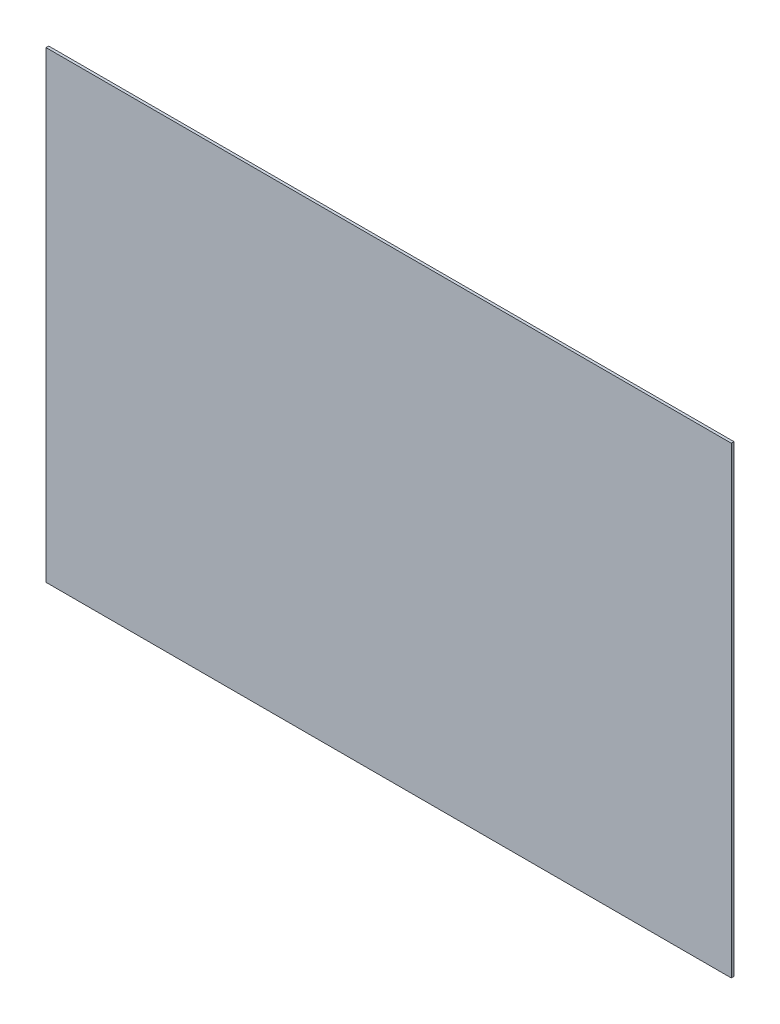
ISO-10303-21;
HEADER;
FILE_DESCRIPTION(('STEP AP214'),'2;1');
FILE_NAME('part.step','',(''),(''),'','','');
FILE_SCHEMA(('AUTOMOTIVE_DESIGN { 1 0 10303 214 1 1 1 1 }'));
ENDSEC;
DATA;
#1=APPLICATION_CONTEXT('core data for automotive mechanical design processes');
#2=APPLICATION_PROTOCOL_DEFINITION('international standard','automotive_design',2000,#1);
#3=PRODUCT_CONTEXT('',#1,'mechanical');
#4=PRODUCT('Part','Part','',(#3));
#5=PRODUCT_RELATED_PRODUCT_CATEGORY('part','',(#4));
#6=PRODUCT_DEFINITION_FORMATION('','',#4);
#7=PRODUCT_DEFINITION_CONTEXT('part definition',#1,'design');
#8=PRODUCT_DEFINITION('design','',#6,#7);
#9=PRODUCT_DEFINITION_SHAPE('','',#8);
#10=(LENGTH_UNIT() NAMED_UNIT(*) SI_UNIT(.MILLI.,.METRE.));
#11=(NAMED_UNIT(*) PLANE_ANGLE_UNIT() SI_UNIT($,.RADIAN.));
#12=(NAMED_UNIT(*) SI_UNIT($,.STERADIAN.) SOLID_ANGLE_UNIT());
#13=UNCERTAINTY_MEASURE_WITH_UNIT(LENGTH_MEASURE(1.E-05),#10,'distance_accuracy_value','');
#14=(GEOMETRIC_REPRESENTATION_CONTEXT(3) GLOBAL_UNCERTAINTY_ASSIGNED_CONTEXT((#13)) GLOBAL_UNIT_ASSIGNED_CONTEXT((#10,
#11,#12)) REPRESENTATION_CONTEXT('',''));
#15=CARTESIAN_POINT('',(0.,0.,0.));
#16=DIRECTION('',(0.,0.,1.));
#17=DIRECTION('',(1.,0.,0.));
#18=AXIS2_PLACEMENT_3D('',#15,#16,#17);
#19=CARTESIAN_POINT('',(0.,0.,0.));
#20=DIRECTION('',(0.,0.,1.));
#21=DIRECTION('',(1.,0.,0.));
#22=AXIS2_PLACEMENT_3D('',#19,#20,#21);
#23=PLANE('',#22);
#24=DIRECTION('',(0.,-1.,0.));
#25=VECTOR('',#24,1.);
#26=CARTESIAN_POINT('',(-127.25,86.,0.));
#27=LINE('',#26,#25);
#28=CARTESIAN_POINT('',(-127.25,86.,0.));
#29=VERTEX_POINT('',#28);
#30=CARTESIAN_POINT('',(-127.25,-86.,0.));
#31=VERTEX_POINT('',#30);
#32=EDGE_CURVE('E128',#29,#31,#27,.T.);
#33=ORIENTED_EDGE('',*,*,#32,.F.);
#34=DIRECTION('',(-1.,0.,0.));
#35=VECTOR('',#34,1.);
#36=CARTESIAN_POINT('',(-127.25,86.,0.));
#37=LINE('',#36,#35);
#38=CARTESIAN_POINT('',(127.25,86.,0.));
#39=VERTEX_POINT('',#38);
#40=EDGE_CURVE('E144',#39,#29,#37,.T.);
#41=ORIENTED_EDGE('',*,*,#40,.F.);
#42=DIRECTION('',(0.,1.,0.));
#43=VECTOR('',#42,1.);
#44=CARTESIAN_POINT('',(127.25,86.,0.));
#45=LINE('',#44,#43);
#46=CARTESIAN_POINT('',(127.25,-86.,0.));
#47=VERTEX_POINT('',#46);
#48=EDGE_CURVE('E156',#47,#39,#45,.T.);
#49=ORIENTED_EDGE('',*,*,#48,.F.);
#50=DIRECTION('',(1.,0.,0.));
#51=VECTOR('',#50,1.);
#52=CARTESIAN_POINT('',(-127.25,-86.,0.));
#53=LINE('',#52,#51);
#54=EDGE_CURVE('E133',#31,#47,#53,.T.);
#55=ORIENTED_EDGE('',*,*,#54,.F.);
#56=EDGE_LOOP('',(#33,#41,#49,#55));
#57=FACE_BOUND('',#56,.T.);
#58=DIRECTION('',(0.,1.,0.));
#59=VECTOR('',#58,1.);
#60=CARTESIAN_POINT('',(-115.,-76.5,0.));
#61=LINE('',#60,#59);
#62=CARTESIAN_POINT('',(-115.,-76.5,0.));
#63=VERTEX_POINT('',#62);
#64=CARTESIAN_POINT('',(-115.,71.5,0.));
#65=VERTEX_POINT('',#64);
#66=EDGE_CURVE('E55',#63,#65,#61,.T.);
#67=ORIENTED_EDGE('',*,*,#66,.F.);
#68=DIRECTION('',(-1.,0.,0.));
#69=VECTOR('',#68,1.);
#70=CARTESIAN_POINT('',(-115.,-76.5,0.));
#71=LINE('',#70,#69);
#72=CARTESIAN_POINT('',(115.,-76.5,0.));
#73=VERTEX_POINT('',#72);
#74=EDGE_CURVE('E59',#73,#63,#71,.T.);
#75=ORIENTED_EDGE('',*,*,#74,.F.);
#76=DIRECTION('',(0.,-1.,0.));
#77=VECTOR('',#76,1.);
#78=CARTESIAN_POINT('',(115.,-76.5,0.));
#79=LINE('',#78,#77);
#80=CARTESIAN_POINT('',(115.,71.5,0.));
#81=VERTEX_POINT('',#80);
#82=EDGE_CURVE('E302',#81,#73,#79,.T.);
#83=ORIENTED_EDGE('',*,*,#82,.F.);
#84=DIRECTION('',(1.,0.,0.));
#85=VECTOR('',#84,1.);
#86=CARTESIAN_POINT('',(-115.,71.5,0.));
#87=LINE('',#86,#85);
#88=EDGE_CURVE('E299',#65,#81,#87,.T.);
#89=ORIENTED_EDGE('',*,*,#88,.F.);
#90=EDGE_LOOP('',(#67,#75,#83,#89));
#91=FACE_BOUND('',#90,.T.);
#92=ADVANCED_FACE('F39',(#57,#91),#23,.F.);
#93=CARTESIAN_POINT('',(-127.25,86.,1.));
#94=DIRECTION('',(1.,0.,0.));
#95=DIRECTION('',(0.,1.,0.));
#96=AXIS2_PLACEMENT_3D('',#93,#94,#95);
#97=PLANE('',#96);
#98=ORIENTED_EDGE('',*,*,#32,.T.);
#99=DIRECTION('',(0.,0.,-1.));
#100=VECTOR('',#99,1.);
#101=CARTESIAN_POINT('',(-127.25,-86.,1.));
#102=LINE('',#101,#100);
#103=CARTESIAN_POINT('',(-127.25,-86.,1.));
#104=VERTEX_POINT('',#103);
#105=EDGE_CURVE('E11',#104,#31,#102,.T.);
#106=ORIENTED_EDGE('',*,*,#105,.F.);
#107=DIRECTION('',(0.,-1.,0.));
#108=VECTOR('',#107,1.);
#109=CARTESIAN_POINT('',(-127.25,86.,1.));
#110=LINE('',#109,#108);
#111=CARTESIAN_POINT('',(-127.25,86.,1.));
#112=VERTEX_POINT('',#111);
#113=EDGE_CURVE('E139',#112,#104,#110,.T.);
#114=ORIENTED_EDGE('',*,*,#113,.F.);
#115=DIRECTION('',(0.,0.,-1.));
#116=VECTOR('',#115,1.);
#117=CARTESIAN_POINT('',(-127.25,86.,1.));
#118=LINE('',#117,#116);
#119=EDGE_CURVE('E152',#112,#29,#118,.T.);
#120=ORIENTED_EDGE('',*,*,#119,.T.);
#121=EDGE_LOOP('',(#98,#106,#114,#120));
#122=FACE_BOUND('',#121,.T.);
#123=ADVANCED_FACE('F41',(#122),#97,.F.);
#124=CARTESIAN_POINT('',(-127.25,-86.,1.));
#125=DIRECTION('',(0.,1.,0.));
#126=DIRECTION('',(0.,0.,1.));
#127=AXIS2_PLACEMENT_3D('',#124,#125,#126);
#128=PLANE('',#127);
#129=ORIENTED_EDGE('',*,*,#54,.T.);
#130=DIRECTION('',(0.,0.,-1.));
#131=VECTOR('',#130,1.);
#132=CARTESIAN_POINT('',(127.25,-86.,1.));
#133=LINE('',#132,#131);
#134=CARTESIAN_POINT('',(127.25,-86.,1.));
#135=VERTEX_POINT('',#134);
#136=EDGE_CURVE('E48',#135,#47,#133,.T.);
#137=ORIENTED_EDGE('',*,*,#136,.F.);
#138=DIRECTION('',(1.,0.,0.));
#139=VECTOR('',#138,1.);
#140=CARTESIAN_POINT('',(-127.25,-86.,1.));
#141=LINE('',#140,#139);
#142=EDGE_CURVE('E143',#104,#135,#141,.T.);
#143=ORIENTED_EDGE('',*,*,#142,.F.);
#144=ORIENTED_EDGE('',*,*,#105,.T.);
#145=EDGE_LOOP('',(#129,#137,#143,#144));
#146=FACE_BOUND('',#145,.T.);
#147=ADVANCED_FACE('F188',(#146),#128,.F.);
#148=CARTESIAN_POINT('',(127.25,86.,1.));
#149=DIRECTION('',(-1.,0.,0.));
#150=DIRECTION('',(0.,0.,1.));
#151=AXIS2_PLACEMENT_3D('',#148,#149,#150);
#152=PLANE('',#151);
#153=ORIENTED_EDGE('',*,*,#48,.T.);
#154=DIRECTION('',(0.,0.,-1.));
#155=VECTOR('',#154,1.);
#156=CARTESIAN_POINT('',(127.25,86.,1.));
#157=LINE('',#156,#155);
#158=CARTESIAN_POINT('',(127.25,86.,1.));
#159=VERTEX_POINT('',#158);
#160=EDGE_CURVE('E164',#159,#39,#157,.T.);
#161=ORIENTED_EDGE('',*,*,#160,.F.);
#162=DIRECTION('',(0.,1.,0.));
#163=VECTOR('',#162,1.);
#164=CARTESIAN_POINT('',(127.25,86.,1.));
#165=LINE('',#164,#163);
#166=EDGE_CURVE('E147',#135,#159,#165,.T.);
#167=ORIENTED_EDGE('',*,*,#166,.F.);
#168=ORIENTED_EDGE('',*,*,#136,.T.);
#169=EDGE_LOOP('',(#153,#161,#167,#168));
#170=FACE_BOUND('',#169,.T.);
#171=ADVANCED_FACE('F173',(#170),#152,.F.);
#172=CARTESIAN_POINT('',(-127.25,86.,1.));
#173=DIRECTION('',(0.,-1.,0.));
#174=DIRECTION('',(0.,0.,-1.));
#175=AXIS2_PLACEMENT_3D('',#172,#173,#174);
#176=PLANE('',#175);
#177=ORIENTED_EDGE('',*,*,#40,.T.);
#178=ORIENTED_EDGE('',*,*,#119,.F.);
#179=DIRECTION('',(-1.,0.,0.));
#180=VECTOR('',#179,1.);
#181=CARTESIAN_POINT('',(-127.25,86.,1.));
#182=LINE('',#181,#180);
#183=EDGE_CURVE('E150',#159,#112,#182,.T.);
#184=ORIENTED_EDGE('',*,*,#183,.F.);
#185=ORIENTED_EDGE('',*,*,#160,.T.);
#186=EDGE_LOOP('',(#177,#178,#184,#185));
#187=FACE_BOUND('',#186,.T.);
#188=ADVANCED_FACE('F181',(#187),#176,.F.);
#189=CARTESIAN_POINT('',(0.,0.,1.));
#190=DIRECTION('',(0.,0.,1.));
#191=DIRECTION('',(1.,0.,0.));
#192=AXIS2_PLACEMENT_3D('',#189,#190,#191);
#193=PLANE('',#192);
#194=ORIENTED_EDGE('',*,*,#113,.T.);
#195=ORIENTED_EDGE('',*,*,#142,.T.);
#196=ORIENTED_EDGE('',*,*,#166,.T.);
#197=ORIENTED_EDGE('',*,*,#183,.T.);
#198=EDGE_LOOP('',(#194,#195,#196,#197));
#199=FACE_BOUND('',#198,.T.);
#200=ADVANCED_FACE('F187',(#199),#193,.T.);
#201=CARTESIAN_POINT('',(-115.,-76.5,-9.));
#202=DIRECTION('',(1.,0.,0.));
#203=DIRECTION('',(0.,1.,0.));
#204=AXIS2_PLACEMENT_3D('',#201,#202,#203);
#205=PLANE('',#204);
#206=ORIENTED_EDGE('',*,*,#66,.T.);
#207=DIRECTION('',(0.,0.,1.));
#208=VECTOR('',#207,1.);
#209=CARTESIAN_POINT('',(-115.,71.5,-9.));
#210=LINE('',#209,#208);
#211=CARTESIAN_POINT('',(-115.,71.5,-9.));
#212=VERTEX_POINT('',#211);
#213=EDGE_CURVE('E108',#212,#65,#210,.T.);
#214=ORIENTED_EDGE('',*,*,#213,.F.);
#215=DIRECTION('',(0.,1.,0.));
#216=VECTOR('',#215,1.);
#217=CARTESIAN_POINT('',(-115.,-76.5,-9.));
#218=LINE('',#217,#216);
#219=CARTESIAN_POINT('',(-115.,-76.5,-9.));
#220=VERTEX_POINT('',#219);
#221=EDGE_CURVE('E115',#220,#212,#218,.T.);
#222=ORIENTED_EDGE('',*,*,#221,.F.);
#223=DIRECTION('',(0.,0.,1.));
#224=VECTOR('',#223,1.);
#225=CARTESIAN_POINT('',(-115.,-76.5,-9.));
#226=LINE('',#225,#224);
#227=EDGE_CURVE('E296',#220,#63,#226,.T.);
#228=ORIENTED_EDGE('',*,*,#227,.T.);
#229=EDGE_LOOP('',(#206,#214,#222,#228));
#230=FACE_BOUND('',#229,.T.);
#231=ADVANCED_FACE('F126',(#230),#205,.F.);
#232=CARTESIAN_POINT('',(-115.,71.5,-9.));
#233=DIRECTION('',(0.,-1.,0.));
#234=DIRECTION('',(1.,0.,0.));
#235=AXIS2_PLACEMENT_3D('',#232,#233,#234);
#236=PLANE('',#235);
#237=ORIENTED_EDGE('',*,*,#88,.T.);
#238=DIRECTION('',(0.,0.,1.));
#239=VECTOR('',#238,1.);
#240=CARTESIAN_POINT('',(115.,71.5,-9.));
#241=LINE('',#240,#239);
#242=CARTESIAN_POINT('',(115.,71.5,-9.));
#243=VERTEX_POINT('',#242);
#244=EDGE_CURVE('E110',#243,#81,#241,.T.);
#245=ORIENTED_EDGE('',*,*,#244,.F.);
#246=DIRECTION('',(1.,0.,0.));
#247=VECTOR('',#246,1.);
#248=CARTESIAN_POINT('',(-115.,71.5,-9.));
#249=LINE('',#248,#247);
#250=EDGE_CURVE('E103',#212,#243,#249,.T.);
#251=ORIENTED_EDGE('',*,*,#250,.F.);
#252=ORIENTED_EDGE('',*,*,#213,.T.);
#253=EDGE_LOOP('',(#237,#245,#251,#252));
#254=FACE_BOUND('',#253,.T.);
#255=ADVANCED_FACE('F106',(#254),#236,.F.);
#256=CARTESIAN_POINT('',(115.,-76.5,-9.));
#257=DIRECTION('',(-1.,0.,0.));
#258=DIRECTION('',(0.,0.,1.));
#259=AXIS2_PLACEMENT_3D('',#256,#257,#258);
#260=PLANE('',#259);
#261=ORIENTED_EDGE('',*,*,#82,.T.);
#262=DIRECTION('',(0.,0.,1.));
#263=VECTOR('',#262,1.);
#264=CARTESIAN_POINT('',(115.,-76.5,-9.));
#265=LINE('',#264,#263);
#266=CARTESIAN_POINT('',(115.,-76.5,-9.));
#267=VERTEX_POINT('',#266);
#268=EDGE_CURVE('E135',#267,#73,#265,.T.);
#269=ORIENTED_EDGE('',*,*,#268,.F.);
#270=DIRECTION('',(0.,-1.,0.));
#271=VECTOR('',#270,1.);
#272=CARTESIAN_POINT('',(115.,-76.5,-9.));
#273=LINE('',#272,#271);
#274=EDGE_CURVE('E114',#243,#267,#273,.T.);
#275=ORIENTED_EDGE('',*,*,#274,.F.);
#276=ORIENTED_EDGE('',*,*,#244,.T.);
#277=EDGE_LOOP('',(#261,#269,#275,#276));
#278=FACE_BOUND('',#277,.T.);
#279=ADVANCED_FACE('F212',(#278),#260,.F.);
#280=CARTESIAN_POINT('',(-115.,-76.5,-9.));
#281=DIRECTION('',(0.,1.,0.));
#282=DIRECTION('',(-1.,0.,0.));
#283=AXIS2_PLACEMENT_3D('',#280,#281,#282);
#284=PLANE('',#283);
#285=ORIENTED_EDGE('',*,*,#74,.T.);
#286=ORIENTED_EDGE('',*,*,#227,.F.);
#287=DIRECTION('',(-1.,0.,0.));
#288=VECTOR('',#287,1.);
#289=CARTESIAN_POINT('',(-115.,-76.5,-9.));
#290=LINE('',#289,#288);
#291=EDGE_CURVE('E120',#267,#220,#290,.T.);
#292=ORIENTED_EDGE('',*,*,#291,.F.);
#293=ORIENTED_EDGE('',*,*,#268,.T.);
#294=EDGE_LOOP('',(#285,#286,#292,#293));
#295=FACE_BOUND('',#294,.T.);
#296=ADVANCED_FACE('F217',(#295),#284,.F.);
#297=CARTESIAN_POINT('',(0.,0.,-9.));
#298=DIRECTION('',(0.,0.,-1.));
#299=DIRECTION('',(-1.,0.,0.));
#300=AXIS2_PLACEMENT_3D('',#297,#298,#299);
#301=PLANE('',#300);
#302=CARTESIAN_POINT('',(-29.,-26.5,-9.));
#303=DIRECTION('',(0.,0.,-1.));
#304=DIRECTION('',(-1.,0.,0.));
#305=AXIS2_PLACEMENT_3D('',#302,#303,#304);
#306=CIRCLE('',#305,1.75);
#307=CARTESIAN_POINT('',(-30.75,-26.5,-9.));
#308=VERTEX_POINT('',#307);
#309=EDGE_CURVE('E278',#308,#308,#306,.T.);
#310=ORIENTED_EDGE('',*,*,#309,.F.);
#311=EDGE_LOOP('',(#310));
#312=FACE_BOUND('',#311,.T.);
#313=CARTESIAN_POINT('',(29.,22.5,-9.));
#314=DIRECTION('',(0.,0.,-1.));
#315=DIRECTION('',(-1.,0.,0.));
#316=AXIS2_PLACEMENT_3D('',#313,#314,#315);
#317=CIRCLE('',#316,1.75);
#318=CARTESIAN_POINT('',(27.25,22.5,-9.));
#319=VERTEX_POINT('',#318);
#320=EDGE_CURVE('E262',#319,#319,#317,.T.);
#321=ORIENTED_EDGE('',*,*,#320,.F.);
#322=EDGE_LOOP('',(#321));
#323=FACE_BOUND('',#322,.T.);
#324=CARTESIAN_POINT('',(-29.,22.5,-9.));
#325=DIRECTION('',(0.,0.,-1.));
#326=DIRECTION('',(-1.,0.,0.));
#327=AXIS2_PLACEMENT_3D('',#324,#325,#326);
#328=CIRCLE('',#327,1.75);
#329=CARTESIAN_POINT('',(-30.75,22.5,-9.));
#330=VERTEX_POINT('',#329);
#331=EDGE_CURVE('E263',#330,#330,#328,.T.);
#332=ORIENTED_EDGE('',*,*,#331,.F.);
#333=EDGE_LOOP('',(#332));
#334=FACE_BOUND('',#333,.T.);
#335=CARTESIAN_POINT('',(29.,-26.5,-9.));
#336=DIRECTION('',(0.,0.,-1.));
#337=DIRECTION('',(-1.,0.,0.));
#338=AXIS2_PLACEMENT_3D('',#335,#336,#337);
#339=CIRCLE('',#338,1.75);
#340=CARTESIAN_POINT('',(27.25,-26.5,-9.));
#341=VERTEX_POINT('',#340);
#342=EDGE_CURVE('E277',#341,#341,#339,.T.);
#343=ORIENTED_EDGE('',*,*,#342,.F.);
#344=EDGE_LOOP('',(#343));
#345=FACE_BOUND('',#344,.T.);
#346=ORIENTED_EDGE('',*,*,#221,.T.);
#347=ORIENTED_EDGE('',*,*,#250,.T.);
#348=ORIENTED_EDGE('',*,*,#274,.T.);
#349=ORIENTED_EDGE('',*,*,#291,.T.);
#350=EDGE_LOOP('',(#346,#347,#348,#349));
#351=FACE_BOUND('',#350,.T.);
#352=ADVANCED_FACE('F118',(#312,#323,#334,#345,#351),#301,.T.);
#353=CARTESIAN_POINT('',(29.,-26.5,-7.));
#354=DIRECTION('',(0.,0.,-1.));
#355=DIRECTION('',(-1.,0.,0.));
#356=AXIS2_PLACEMENT_3D('',#353,#354,#355);
#357=CYLINDRICAL_SURFACE('',#356,1.75);
#358=CARTESIAN_POINT('',(29.,-26.5,-7.));
#359=DIRECTION('',(0.,0.,-1.));
#360=DIRECTION('',(-1.,0.,0.));
#361=AXIS2_PLACEMENT_3D('',#358,#359,#360);
#362=CIRCLE('',#361,1.75);
#363=CARTESIAN_POINT('',(27.25,-26.5,-7.));
#364=VERTEX_POINT('',#363);
#365=EDGE_CURVE('E285',#364,#364,#362,.T.);
#366=ORIENTED_EDGE('',*,*,#365,.F.);
#367=EDGE_LOOP('',(#366));
#368=FACE_BOUND('',#367,.T.);
#369=ORIENTED_EDGE('',*,*,#342,.T.);
#370=EDGE_LOOP('',(#369));
#371=FACE_BOUND('',#370,.T.);
#372=ADVANCED_FACE('F224',(#368,#371),#357,.F.);
#373=CARTESIAN_POINT('',(29.,-26.5,-7.));
#374=DIRECTION('',(0.,0.,-1.));
#375=DIRECTION('',(-1.,0.,0.));
#376=AXIS2_PLACEMENT_3D('',#373,#374,#375);
#377=PLANE('',#376);
#378=ORIENTED_EDGE('',*,*,#365,.T.);
#379=EDGE_LOOP('',(#378));
#380=FACE_BOUND('',#379,.T.);
#381=ADVANCED_FACE('F228',(#380),#377,.T.);
#382=CARTESIAN_POINT('',(-29.,22.5,-7.));
#383=DIRECTION('',(0.,0.,-1.));
#384=DIRECTION('',(-1.,0.,0.));
#385=AXIS2_PLACEMENT_3D('',#382,#383,#384);
#386=CYLINDRICAL_SURFACE('',#385,1.75);
#387=CARTESIAN_POINT('',(-29.,22.5,-7.));
#388=DIRECTION('',(0.,0.,-1.));
#389=DIRECTION('',(-1.,0.,0.));
#390=AXIS2_PLACEMENT_3D('',#387,#388,#389);
#391=CIRCLE('',#390,1.75);
#392=CARTESIAN_POINT('',(-30.75,22.5,-7.));
#393=VERTEX_POINT('',#392);
#394=EDGE_CURVE('E260',#393,#393,#391,.T.);
#395=ORIENTED_EDGE('',*,*,#394,.F.);
#396=EDGE_LOOP('',(#395));
#397=FACE_BOUND('',#396,.T.);
#398=ORIENTED_EDGE('',*,*,#331,.T.);
#399=EDGE_LOOP('',(#398));
#400=FACE_BOUND('',#399,.T.);
#401=ADVANCED_FACE('F232',(#397,#400),#386,.F.);
#402=CARTESIAN_POINT('',(-29.,22.5,-7.));
#403=DIRECTION('',(0.,0.,-1.));
#404=DIRECTION('',(-1.,0.,0.));
#405=AXIS2_PLACEMENT_3D('',#402,#403,#404);
#406=PLANE('',#405);
#407=ORIENTED_EDGE('',*,*,#394,.T.);
#408=EDGE_LOOP('',(#407));
#409=FACE_BOUND('',#408,.T.);
#410=ADVANCED_FACE('F238',(#409),#406,.T.);
#411=CARTESIAN_POINT('',(29.,22.5,-7.));
#412=DIRECTION('',(0.,0.,-1.));
#413=DIRECTION('',(-1.,0.,0.));
#414=AXIS2_PLACEMENT_3D('',#411,#412,#413);
#415=CYLINDRICAL_SURFACE('',#414,1.75);
#416=CARTESIAN_POINT('',(29.,22.5,-7.));
#417=DIRECTION('',(0.,0.,-1.));
#418=DIRECTION('',(-1.,0.,0.));
#419=AXIS2_PLACEMENT_3D('',#416,#417,#418);
#420=CIRCLE('',#419,1.75);
#421=CARTESIAN_POINT('',(27.25,22.5,-7.));
#422=VERTEX_POINT('',#421);
#423=EDGE_CURVE('E268',#422,#422,#420,.T.);
#424=ORIENTED_EDGE('',*,*,#423,.F.);
#425=EDGE_LOOP('',(#424));
#426=FACE_BOUND('',#425,.T.);
#427=ORIENTED_EDGE('',*,*,#320,.T.);
#428=EDGE_LOOP('',(#427));
#429=FACE_BOUND('',#428,.T.);
#430=ADVANCED_FACE('F234',(#426,#429),#415,.F.);
#431=CARTESIAN_POINT('',(29.,22.5,-7.));
#432=DIRECTION('',(0.,0.,-1.));
#433=DIRECTION('',(-1.,0.,0.));
#434=AXIS2_PLACEMENT_3D('',#431,#432,#433);
#435=PLANE('',#434);
#436=ORIENTED_EDGE('',*,*,#423,.T.);
#437=EDGE_LOOP('',(#436));
#438=FACE_BOUND('',#437,.T.);
#439=ADVANCED_FACE('F237',(#438),#435,.T.);
#440=CARTESIAN_POINT('',(-29.,-26.5,-7.));
#441=DIRECTION('',(0.,0.,-1.));
#442=DIRECTION('',(-1.,0.,0.));
#443=AXIS2_PLACEMENT_3D('',#440,#441,#442);
#444=CYLINDRICAL_SURFACE('',#443,1.75);
#445=CARTESIAN_POINT('',(-29.,-26.5,-7.));
#446=DIRECTION('',(0.,0.,-1.));
#447=DIRECTION('',(-1.,0.,0.));
#448=AXIS2_PLACEMENT_3D('',#445,#446,#447);
#449=CIRCLE('',#448,1.75);
#450=CARTESIAN_POINT('',(-30.75,-26.5,-7.));
#451=VERTEX_POINT('',#450);
#452=EDGE_CURVE('E273',#451,#451,#449,.T.);
#453=ORIENTED_EDGE('',*,*,#452,.F.);
#454=EDGE_LOOP('',(#453));
#455=FACE_BOUND('',#454,.T.);
#456=ORIENTED_EDGE('',*,*,#309,.T.);
#457=EDGE_LOOP('',(#456));
#458=FACE_BOUND('',#457,.T.);
#459=ADVANCED_FACE('F242',(#455,#458),#444,.F.);
#460=CARTESIAN_POINT('',(-29.,-26.5,-7.));
#461=DIRECTION('',(0.,0.,-1.));
#462=DIRECTION('',(-1.,0.,0.));
#463=AXIS2_PLACEMENT_3D('',#460,#461,#462);
#464=PLANE('',#463);
#465=ORIENTED_EDGE('',*,*,#452,.T.);
#466=EDGE_LOOP('',(#465));
#467=FACE_BOUND('',#466,.T.);
#468=ADVANCED_FACE('F246',(#467),#464,.T.);
#469=CLOSED_SHELL('',(#92,#123,#147,#171,#188,#200,#231,#255,#279,#296,#352,#372,#381,#401,#410,
#430,#439,#459,#468));
#470=MANIFOLD_SOLID_BREP('B2',#469);
#471=ADVANCED_BREP_SHAPE_REPRESENTATION('',(#18,#470),#14);
#472=SHAPE_DEFINITION_REPRESENTATION(#9,#471);
ENDSEC;
END-ISO-10303-21;
